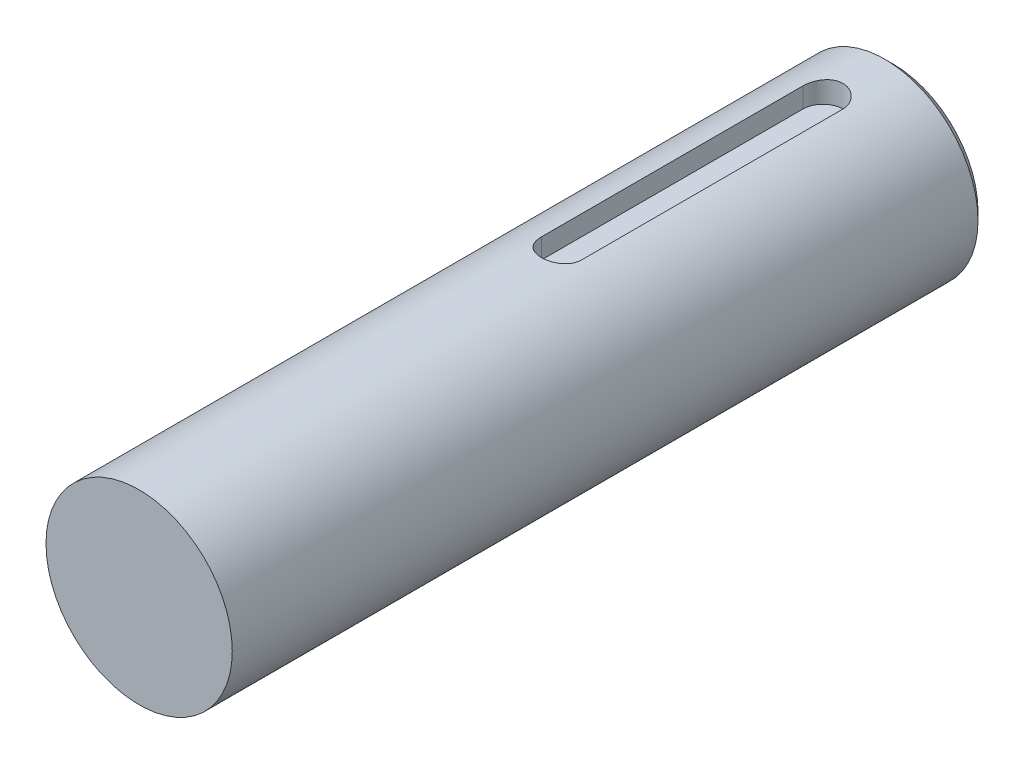
ISO-10303-21;
HEADER;
FILE_DESCRIPTION(('STEP AP214'),'2;1');
FILE_NAME('part.step','',(''),(''),'','','');
FILE_SCHEMA(('AUTOMOTIVE_DESIGN { 1 0 10303 214 1 1 1 1 }'));
ENDSEC;
DATA;
#1=APPLICATION_CONTEXT('core data for automotive mechanical design processes');
#2=APPLICATION_PROTOCOL_DEFINITION('international standard','automotive_design',2000,#1);
#3=PRODUCT_CONTEXT('',#1,'mechanical');
#4=PRODUCT('Part','Part','',(#3));
#5=PRODUCT_RELATED_PRODUCT_CATEGORY('part','',(#4));
#6=PRODUCT_DEFINITION_FORMATION('','',#4);
#7=PRODUCT_DEFINITION_CONTEXT('part definition',#1,'design');
#8=PRODUCT_DEFINITION('design','',#6,#7);
#9=PRODUCT_DEFINITION_SHAPE('','',#8);
#10=(LENGTH_UNIT() NAMED_UNIT(*) SI_UNIT(.MILLI.,.METRE.));
#11=(NAMED_UNIT(*) PLANE_ANGLE_UNIT() SI_UNIT($,.RADIAN.));
#12=(NAMED_UNIT(*) SI_UNIT($,.STERADIAN.) SOLID_ANGLE_UNIT());
#13=UNCERTAINTY_MEASURE_WITH_UNIT(LENGTH_MEASURE(1.E-05),#10,'distance_accuracy_value','');
#14=(GEOMETRIC_REPRESENTATION_CONTEXT(3) GLOBAL_UNCERTAINTY_ASSIGNED_CONTEXT((#13)) GLOBAL_UNIT_ASSIGNED_CONTEXT((#10,
#11,#12)) REPRESENTATION_CONTEXT('',''));
#15=CARTESIAN_POINT('',(0.,0.,0.));
#16=DIRECTION('',(0.,0.,1.));
#17=DIRECTION('',(1.,0.,0.));
#18=AXIS2_PLACEMENT_3D('',#15,#16,#17);
#19=CARTESIAN_POINT('',(0.,8.4650046061713,8.39));
#20=DIRECTION('',(0.,1.,0.));
#21=DIRECTION('',(-1.,0.,0.));
#22=AXIS2_PLACEMENT_3D('',#19,#20,#21);
#23=CYLINDRICAL_SURFACE('',#22,2.39);
#24=DIRECTION('',(0.,-1.,0.));
#25=VECTOR('',#24,1.);
#26=CARTESIAN_POINT('',(-2.39,8.46500460617129,8.39));
#27=LINE('',#26,#25);
#28=CARTESIAN_POINT('',(-2.39,8.46500460617129,8.39));
#29=VERTEX_POINT('',#28);
#30=CARTESIAN_POINT('',(-2.39,10.8550046061713,8.39));
#31=VERTEX_POINT('',#30);
#32=EDGE_CURVE('E88',#29,#31,#27,.F.);
#33=ORIENTED_EDGE('',*,*,#32,.F.);
#34=CARTESIAN_POINT('',(0.,8.46500460617129,8.39));
#35=DIRECTION('',(0.,-1.,0.));
#36=DIRECTION('',(0.,0.,-1.));
#37=AXIS2_PLACEMENT_3D('',#34,#35,#36);
#38=CIRCLE('',#37,2.39);
#39=CARTESIAN_POINT('',(2.39,8.46500460617129,8.39));
#40=VERTEX_POINT('',#39);
#41=EDGE_CURVE('E49',#40,#29,#38,.F.);
#42=ORIENTED_EDGE('',*,*,#41,.F.);
#43=DIRECTION('',(0.,-1.,0.));
#44=VECTOR('',#43,1.);
#45=CARTESIAN_POINT('',(2.39,8.4650046061713,8.39));
#46=LINE('',#45,#44);
#47=CARTESIAN_POINT('',(2.39,10.8550046061713,8.39));
#48=VERTEX_POINT('',#47);
#49=EDGE_CURVE('E153',#48,#40,#46,.T.);
#50=ORIENTED_EDGE('',*,*,#49,.F.);
#51=CARTESIAN_POINT('',(-2.39,10.8550046061713,8.39));
#52=CARTESIAN_POINT('',(-2.39000734191248,10.8549983687136,8.32360956009436));
#53=CARTESIAN_POINT('',(-2.38723375886823,10.8556135460616,8.25722326023558));
#54=CARTESIAN_POINT('',(-2.37618171035081,10.8580405240172,8.12494125855236));
#55=CARTESIAN_POINT('',(-2.36790399299528,10.8598521620027,8.05904549128578));
#56=CARTESIAN_POINT('',(-2.34591869507791,10.8646219556217,7.92831608171232));
#57=CARTESIAN_POINT('',(-2.33222006041986,10.867578222152,7.86348087186106));
#58=CARTESIAN_POINT('',(-2.2995158897934,10.8745449972966,7.73523927662785));
#59=CARTESIAN_POINT('',(-2.28051031825321,10.8785555129773,7.67183290082629));
#60=CARTESIAN_POINT('',(-2.21572667497567,10.8920041351876,7.48441277067381));
#61=CARTESIAN_POINT('',(-2.16216321561695,10.9028635775124,7.36308914252172));
#62=CARTESIAN_POINT('',(-2.03592161306182,10.9271383410635,7.13119788815063));
#63=CARTESIAN_POINT('',(-1.96324133012041,10.9405539483547,7.0206314678843));
#64=CARTESIAN_POINT('',(-1.79956481500424,10.9686722105481,6.81153997300938));
#65=CARTESIAN_POINT('',(-1.70831914635767,10.9833906591269,6.71321193243198));
#66=CARTESIAN_POINT('',(-1.51061108089373,11.012322291026,6.53310893722586));
#67=CARTESIAN_POINT('',(-1.4041431799668,11.0265352892523,6.45133999605106));
#68=CARTESIAN_POINT('',(-1.17766189829818,11.0530295557368,6.30588924510438));
#69=CARTESIAN_POINT('',(-1.05751749265979,11.0652888681814,6.24240730345432));
#70=CARTESIAN_POINT('',(-0.808044609429739,11.0862929762596,6.13667482394494));
#71=CARTESIAN_POINT('',(-0.678727258929243,11.0950419470789,6.09439904848907));
#72=CARTESIAN_POINT('',(-0.45728482975718,11.1059524071681,6.04235133302418));
#73=CARTESIAN_POINT('',(-0.36660268226896,11.1093281579297,6.02649525687019));
#74=CARTESIAN_POINT('',(-0.183959724526367,11.1138530058135,6.0053176115786));
#75=CARTESIAN_POINT('',(-0.0919989190446422,11.1150021112446,5.99999600313126));
#76=CARTESIAN_POINT('',(0.132581093694627,11.1149969574522,6.00000575995059));
#77=CARTESIAN_POINT('',(0.265241342196514,11.1126030512096,6.01107181521463));
#78=CARTESIAN_POINT('',(0.526820104049925,11.1032817783095,6.05500850793449));
#79=CARTESIAN_POINT('',(0.65573479011455,11.0963499338472,6.08790068272223));
#80=CARTESIAN_POINT('',(0.905968578525229,11.0787257728507,6.17441377927132));
#81=CARTESIAN_POINT('',(1.02729614277334,11.0680377369942,6.22801111163241));
#82=CARTESIAN_POINT('',(1.25922640022453,11.0440565703912,6.35434494686232));
#83=CARTESIAN_POINT('',(1.36982982105811,11.030763616573,6.42708014998601));
#84=CARTESIAN_POINT('',(1.57890120088466,11.0027991437057,6.59082087260809));
#85=CARTESIAN_POINT('',(1.67717880544349,10.988111010917,6.68206661868656));
#86=CARTESIAN_POINT('',(1.85716305054479,10.9591286253242,6.87973083251524));
#87=CARTESIAN_POINT('',(1.93886753513076,10.9448344239743,6.98615127124139));
#88=CARTESIAN_POINT('',(2.0842318995129,10.9180924616802,7.21255580927915));
#89=CARTESIAN_POINT('',(2.14768514307928,10.9056665516524,7.33267524631302));
#90=CARTESIAN_POINT('',(2.25340124925363,10.8843159756616,7.58216025614665));
#91=CARTESIAN_POINT('',(2.29567850856785,10.8753889318597,7.71151947863483));
#92=CARTESIAN_POINT('',(2.34770304194687,10.8642524659001,7.93300314236975));
#93=CARTESIAN_POINT('',(2.36354426370291,10.8608050560104,8.02368052044061));
#94=CARTESIAN_POINT('',(2.38469692247253,10.8561723073476,8.20622347920761));
#95=CARTESIAN_POINT('',(2.39001834364657,10.8549848237577,8.29808784990183));
#96=CARTESIAN_POINT('',(2.39,10.8550046061713,8.39));
#97=B_SPLINE_CURVE_WITH_KNOTS('',3,(#51,#52,#53,#54,#55,#56,#57,#58,#59,#60,#61,#62,#63,#64,#65,
#66,#67,#68,#69,#70,#71,#72,#73,#74,#75,#76,#77,#78,#79,#80,#81,#82,#83,#84,#85,#86,#87,#88,#89,
#90,#91,#92,#93,#94,#95,#96),.UNSPECIFIED.,.F.,.F.,(4,2,2,2,2,2,2,2,2,2,2,2,2,2,2,2,2,2,2,2,2,2,
4),(0.,0.199103352512601,0.398179648583174,0.596928778640243,0.795679240922258,1.19285281504072,
1.59007086370722,1.99302741073697,2.39613003046835,2.80348432072731,3.21035265891377,
3.48611497103965,3.76187625414674,4.15928018989418,4.55707685572273,4.95442164181563,
5.35173944926945,5.75458785737136,6.15748863747256,6.56478596856175,6.97180601732606,
7.24755230042069,7.52303675161283),.UNSPECIFIED.);
#98=EDGE_CURVE('E11',#48,#31,#97,.F.);
#99=ORIENTED_EDGE('',*,*,#98,.T.);
#100=EDGE_LOOP('',(#33,#42,#50,#99));
#101=FACE_BOUND('',#100,.T.);
#102=ADVANCED_FACE('F35',(#101),#23,.F.);
#103=CARTESIAN_POINT('',(0.,10.8550046061713,39.61));
#104=DIRECTION('',(0.,1.,0.));
#105=DIRECTION('',(-1.,0.,0.));
#106=AXIS2_PLACEMENT_3D('',#103,#104,#105);
#107=CYLINDRICAL_SURFACE('',#106,2.39);
#108=DIRECTION('',(0.,1.,0.));
#109=VECTOR('',#108,1.);
#110=CARTESIAN_POINT('',(-2.39,8.46500460617129,39.61));
#111=LINE('',#110,#109);
#112=CARTESIAN_POINT('',(-2.39,10.8550046061713,39.61));
#113=VERTEX_POINT('',#112);
#114=CARTESIAN_POINT('',(-2.39,8.46500460617129,39.61));
#115=VERTEX_POINT('',#114);
#116=EDGE_CURVE('E92',#113,#115,#111,.F.);
#117=ORIENTED_EDGE('',*,*,#116,.F.);
#118=CARTESIAN_POINT('',(2.39,10.8550046061713,39.61));
#119=CARTESIAN_POINT('',(2.39000734191248,10.8549983687136,39.6763904399056));
#120=CARTESIAN_POINT('',(2.38723375886823,10.8556135460616,39.7427767397644));
#121=CARTESIAN_POINT('',(2.37618171035081,10.8580405240172,39.8750587414476));
#122=CARTESIAN_POINT('',(2.36790399299528,10.8598521620027,39.9409545087142));
#123=CARTESIAN_POINT('',(2.34591869507791,10.8646219556217,40.0716839182877));
#124=CARTESIAN_POINT('',(2.33222006041986,10.867578222152,40.1365191281389));
#125=CARTESIAN_POINT('',(2.29951588979341,10.8745449972966,40.2647607233721));
#126=CARTESIAN_POINT('',(2.28051031825321,10.8785555129773,40.3281670991737));
#127=CARTESIAN_POINT('',(2.21572667497567,10.8920041351876,40.5155872293262));
#128=CARTESIAN_POINT('',(2.16216321561696,10.9028635775124,40.6369108574783));
#129=CARTESIAN_POINT('',(2.03592161306183,10.9271383410635,40.8688021118493));
#130=CARTESIAN_POINT('',(1.96324133012041,10.9405539483547,40.9793685321157));
#131=CARTESIAN_POINT('',(1.79956481500425,10.9686722105481,41.1884600269906));
#132=CARTESIAN_POINT('',(1.70831914635768,10.9833906591269,41.286788067568));
#133=CARTESIAN_POINT('',(1.51061108089373,11.012322291026,41.4668910627741));
#134=CARTESIAN_POINT('',(1.4041431799668,11.0265352892523,41.5486600039489));
#135=CARTESIAN_POINT('',(1.17766189829818,11.0530295557368,41.6941107548956));
#136=CARTESIAN_POINT('',(1.05751749265978,11.0652888681814,41.7575926965457));
#137=CARTESIAN_POINT('',(0.808044609429737,11.0862929762596,41.863325176055));
#138=CARTESIAN_POINT('',(0.678727258929242,11.0950419470789,41.9056009515109));
#139=CARTESIAN_POINT('',(0.457284829757237,11.1059524071681,41.9576486669758));
#140=CARTESIAN_POINT('',(0.366602682269076,11.1093281579297,41.9735047431298));
#141=CARTESIAN_POINT('',(0.183959724526604,11.1138530058135,41.9946823884214));
#142=CARTESIAN_POINT('',(0.09199891904494,11.1150021112446,42.0000039968687));
#143=CARTESIAN_POINT('',(-0.132581093694268,11.1149969574522,41.9999942400494));
#144=CARTESIAN_POINT('',(-0.265241342196155,11.1126030512096,41.9889281847854));
#145=CARTESIAN_POINT('',(-0.526820104049571,11.1032817783095,41.9449914920656));
#146=CARTESIAN_POINT('',(-0.6557347901142,11.0963499338472,41.9120993172779));
#147=CARTESIAN_POINT('',(-0.905968578524892,11.0787257728507,41.8255862207288));
#148=CARTESIAN_POINT('',(-1.02729614277301,11.0680377369942,41.7719888883677));
#149=CARTESIAN_POINT('',(-1.25922640022422,11.0440565703913,41.6456550531379));
#150=CARTESIAN_POINT('',(-1.36982982105781,11.030763616573,41.5729198500142));
#151=CARTESIAN_POINT('',(-1.57890120088438,11.0027991437058,41.4091791273922));
#152=CARTESIAN_POINT('',(-1.67717880544322,10.9881110109171,41.3179333813137));
#153=CARTESIAN_POINT('',(-1.85716305054455,10.9591286253242,41.120269167485));
#154=CARTESIAN_POINT('',(-1.93886753513054,10.9448344239743,41.0138487287589));
#155=CARTESIAN_POINT('',(-2.08423189951271,10.9180924616802,40.7874441907212));
#156=CARTESIAN_POINT('',(-2.14768514307911,10.9056665516524,40.6673247536873));
#157=CARTESIAN_POINT('',(-2.2534012492535,10.8843159756616,40.4178397438537));
#158=CARTESIAN_POINT('',(-2.29567850856774,10.8753889318597,40.2884805213655));
#159=CARTESIAN_POINT('',(-2.34770304194682,10.8642524659001,40.0669968576305));
#160=CARTESIAN_POINT('',(-2.36354426370288,10.8608050560104,39.9763194795596));
#161=CARTESIAN_POINT('',(-2.38469692247253,10.8561723073476,39.7937765207925));
#162=CARTESIAN_POINT('',(-2.39001834364657,10.8549848237577,39.7019121500982));
#163=CARTESIAN_POINT('',(-2.39,10.8550046061713,39.61));
#164=B_SPLINE_CURVE_WITH_KNOTS('',3,(#118,#119,#120,#121,#122,#123,#124,#125,#126,#127,#128,
#129,#130,#131,#132,#133,#134,#135,#136,#137,#138,#139,#140,#141,#142,#143,#144,#145,#146,#147,
#148,#149,#150,#151,#152,#153,#154,#155,#156,#157,#158,#159,#160,#161,#162,#163),.UNSPECIFIED.,
.F.,.F.,(4,2,2,2,2,2,2,2,2,2,2,2,2,2,2,2,2,2,2,2,2,2,4),(0.,0.199103352512608,0.398179648583177,
0.596928778640239,0.795679240922256,1.19285281504071,1.59007086370722,1.99302741073697,
2.39613003046836,2.80348432072732,3.21035265891378,3.48611497103948,3.76187625414639,
4.15928018989383,4.55707685572237,4.95442164181527,5.35173944926908,5.75458785737099,
6.15748863747219,6.56478596856138,6.9718060173257,7.24755230042051,7.52303675161285),.UNSPECIFIED.);
#165=CARTESIAN_POINT('',(2.39,10.8550046061713,39.61));
#166=VERTEX_POINT('',#165);
#167=EDGE_CURVE('E77',#113,#166,#164,.F.);
#168=ORIENTED_EDGE('',*,*,#167,.T.);
#169=DIRECTION('',(0.,1.,0.));
#170=VECTOR('',#169,1.);
#171=CARTESIAN_POINT('',(2.39,10.8550046061713,39.61));
#172=LINE('',#171,#170);
#173=CARTESIAN_POINT('',(2.39,8.46500460617129,39.61));
#174=VERTEX_POINT('',#173);
#175=EDGE_CURVE('E97',#174,#166,#172,.T.);
#176=ORIENTED_EDGE('',*,*,#175,.F.);
#177=CARTESIAN_POINT('',(0.,8.46500460617129,39.61));
#178=DIRECTION('',(0.,-1.,0.));
#179=DIRECTION('',(0.,0.,-1.));
#180=AXIS2_PLACEMENT_3D('',#177,#178,#179);
#181=CIRCLE('',#180,2.39);
#182=EDGE_CURVE('E89',#115,#174,#181,.F.);
#183=ORIENTED_EDGE('',*,*,#182,.F.);
#184=EDGE_LOOP('',(#117,#168,#176,#183));
#185=FACE_BOUND('',#184,.T.);
#186=ADVANCED_FACE('F93',(#185),#107,.F.);
#187=CARTESIAN_POINT('',(0.,0.,90.));
#188=DIRECTION('',(0.,0.,-1.));
#189=DIRECTION('',(-1.,0.,0.));
#190=AXIS2_PLACEMENT_3D('',#187,#188,#189);
#191=CYLINDRICAL_SURFACE('',#190,11.115);
#192=ORIENTED_EDGE('',*,*,#98,.F.);
#193=DIRECTION('',(0.,0.,-1.));
#194=VECTOR('',#193,1.);
#195=CARTESIAN_POINT('',(2.39,10.8550046061713,42.));
#196=LINE('',#195,#194);
#197=EDGE_CURVE('E84',#166,#48,#196,.T.);
#198=ORIENTED_EDGE('',*,*,#197,.F.);
#199=ORIENTED_EDGE('',*,*,#167,.F.);
#200=DIRECTION('',(0.,0.,-1.));
#201=VECTOR('',#200,1.);
#202=CARTESIAN_POINT('',(-2.39,10.8550046061713,42.));
#203=LINE('',#202,#201);
#204=EDGE_CURVE('E82',#113,#31,#203,.T.);
#205=ORIENTED_EDGE('',*,*,#204,.T.);
#206=EDGE_LOOP('',(#192,#198,#199,#205));
#207=FACE_BOUND('',#206,.T.);
#208=CARTESIAN_POINT('',(0.,0.,90.));
#209=DIRECTION('',(0.,0.,1.));
#210=DIRECTION('',(1.,0.,0.));
#211=AXIS2_PLACEMENT_3D('',#208,#209,#210);
#212=CIRCLE('',#211,11.115);
#213=CARTESIAN_POINT('',(11.115,0.,90.));
#214=VERTEX_POINT('',#213);
#215=EDGE_CURVE('E102',#214,#214,#212,.T.);
#216=ORIENTED_EDGE('',*,*,#215,.F.);
#217=EDGE_LOOP('',(#216));
#218=FACE_BOUND('',#217,.T.);
#219=CARTESIAN_POINT('',(0.,0.,1.00000000000007));
#220=DIRECTION('',(0.,0.,1.));
#221=DIRECTION('',(1.,0.,0.));
#222=AXIS2_PLACEMENT_3D('',#219,#220,#221);
#223=CIRCLE('',#222,11.115);
#224=CARTESIAN_POINT('',(11.115,0.,1.00000000000007));
#225=VERTEX_POINT('',#224);
#226=EDGE_CURVE('E106',#225,#225,#223,.T.);
#227=ORIENTED_EDGE('',*,*,#226,.T.);
#228=EDGE_LOOP('',(#227));
#229=FACE_BOUND('',#228,.T.);
#230=ADVANCED_FACE('F79',(#207,#218,#229),#191,.T.);
#231=CARTESIAN_POINT('',(0.,0.,90.));
#232=DIRECTION('',(0.,0.,1.));
#233=DIRECTION('',(1.,0.,0.));
#234=AXIS2_PLACEMENT_3D('',#231,#232,#233);
#235=PLANE('',#234);
#236=ORIENTED_EDGE('',*,*,#215,.T.);
#237=EDGE_LOOP('',(#236));
#238=FACE_BOUND('',#237,.T.);
#239=ADVANCED_FACE('F146',(#238),#235,.T.);
#240=CARTESIAN_POINT('',(0.,0.,0.));
#241=DIRECTION('',(0.,0.,1.));
#242=DIRECTION('',(1.,0.,0.));
#243=AXIS2_PLACEMENT_3D('',#240,#241,#242);
#244=PLANE('',#243);
#245=CARTESIAN_POINT('',(0.,0.,0.));
#246=DIRECTION('',(0.,0.,1.));
#247=DIRECTION('',(1.,0.,0.));
#248=AXIS2_PLACEMENT_3D('',#245,#246,#247);
#249=CIRCLE('',#248,10.1149999999999);
#250=CARTESIAN_POINT('',(10.1149999999999,0.,0.));
#251=VERTEX_POINT('',#250);
#252=EDGE_CURVE('E98',#251,#251,#249,.F.);
#253=ORIENTED_EDGE('',*,*,#252,.T.);
#254=EDGE_LOOP('',(#253));
#255=FACE_BOUND('',#254,.T.);
#256=ADVANCED_FACE('F138',(#255),#244,.F.);
#257=CARTESIAN_POINT('',(0.,0.,1.00000000000007));
#258=DIRECTION('',(0.,0.,1.));
#259=DIRECTION('',(1.,0.,0.));
#260=AXIS2_PLACEMENT_3D('',#257,#258,#259);
#261=CONICAL_SURFACE('',#260,11.115,0.785398163397453);
#262=ORIENTED_EDGE('',*,*,#252,.F.);
#263=EDGE_LOOP('',(#262));
#264=FACE_BOUND('',#263,.T.);
#265=ORIENTED_EDGE('',*,*,#226,.F.);
#266=EDGE_LOOP('',(#265));
#267=FACE_BOUND('',#266,.T.);
#268=ADVANCED_FACE('F134',(#264,#267),#261,.T.);
#269=CARTESIAN_POINT('',(-2.39,8.46500460617129,42.));
#270=DIRECTION('',(-1.,0.,0.));
#271=DIRECTION('',(0.,-1.,0.));
#272=AXIS2_PLACEMENT_3D('',#269,#270,#271);
#273=PLANE('',#272);
#274=DIRECTION('',(0.,0.,-1.));
#275=VECTOR('',#274,1.);
#276=CARTESIAN_POINT('',(-2.39,8.46500460617129,42.));
#277=LINE('',#276,#275);
#278=EDGE_CURVE('E103',#115,#29,#277,.T.);
#279=ORIENTED_EDGE('',*,*,#278,.T.);
#280=ORIENTED_EDGE('',*,*,#32,.T.);
#281=ORIENTED_EDGE('',*,*,#204,.F.);
#282=ORIENTED_EDGE('',*,*,#116,.T.);
#283=EDGE_LOOP('',(#279,#280,#281,#282));
#284=FACE_BOUND('',#283,.T.);
#285=ADVANCED_FACE('F101',(#284),#273,.F.);
#286=CARTESIAN_POINT('',(2.39,8.46500460617129,42.));
#287=DIRECTION('',(0.,-1.,0.));
#288=DIRECTION('',(0.,0.,-1.));
#289=AXIS2_PLACEMENT_3D('',#286,#287,#288);
#290=PLANE('',#289);
#291=DIRECTION('',(0.,0.,-1.));
#292=VECTOR('',#291,1.);
#293=CARTESIAN_POINT('',(2.39,8.46500460617129,42.));
#294=LINE('',#293,#292);
#295=EDGE_CURVE('E108',#174,#40,#294,.T.);
#296=ORIENTED_EDGE('',*,*,#295,.T.);
#297=ORIENTED_EDGE('',*,*,#41,.T.);
#298=ORIENTED_EDGE('',*,*,#278,.F.);
#299=ORIENTED_EDGE('',*,*,#182,.T.);
#300=EDGE_LOOP('',(#296,#297,#298,#299));
#301=FACE_BOUND('',#300,.T.);
#302=ADVANCED_FACE('F144',(#301),#290,.F.);
#303=CARTESIAN_POINT('',(2.39,10.8550046061713,42.));
#304=DIRECTION('',(1.,0.,0.));
#305=DIRECTION('',(0.,0.,-1.));
#306=AXIS2_PLACEMENT_3D('',#303,#304,#305);
#307=PLANE('',#306);
#308=ORIENTED_EDGE('',*,*,#197,.T.);
#309=ORIENTED_EDGE('',*,*,#49,.T.);
#310=ORIENTED_EDGE('',*,*,#295,.F.);
#311=ORIENTED_EDGE('',*,*,#175,.T.);
#312=EDGE_LOOP('',(#308,#309,#310,#311));
#313=FACE_BOUND('',#312,.T.);
#314=ADVANCED_FACE('F157',(#313),#307,.F.);
#315=CLOSED_SHELL('',(#102,#186,#230,#239,#256,#268,#285,#302,#314));
#316=MANIFOLD_SOLID_BREP('B2',#315);
#317=ADVANCED_BREP_SHAPE_REPRESENTATION('',(#18,#316),#14);
#318=SHAPE_DEFINITION_REPRESENTATION(#9,#317);
ENDSEC;
END-ISO-10303-21;
